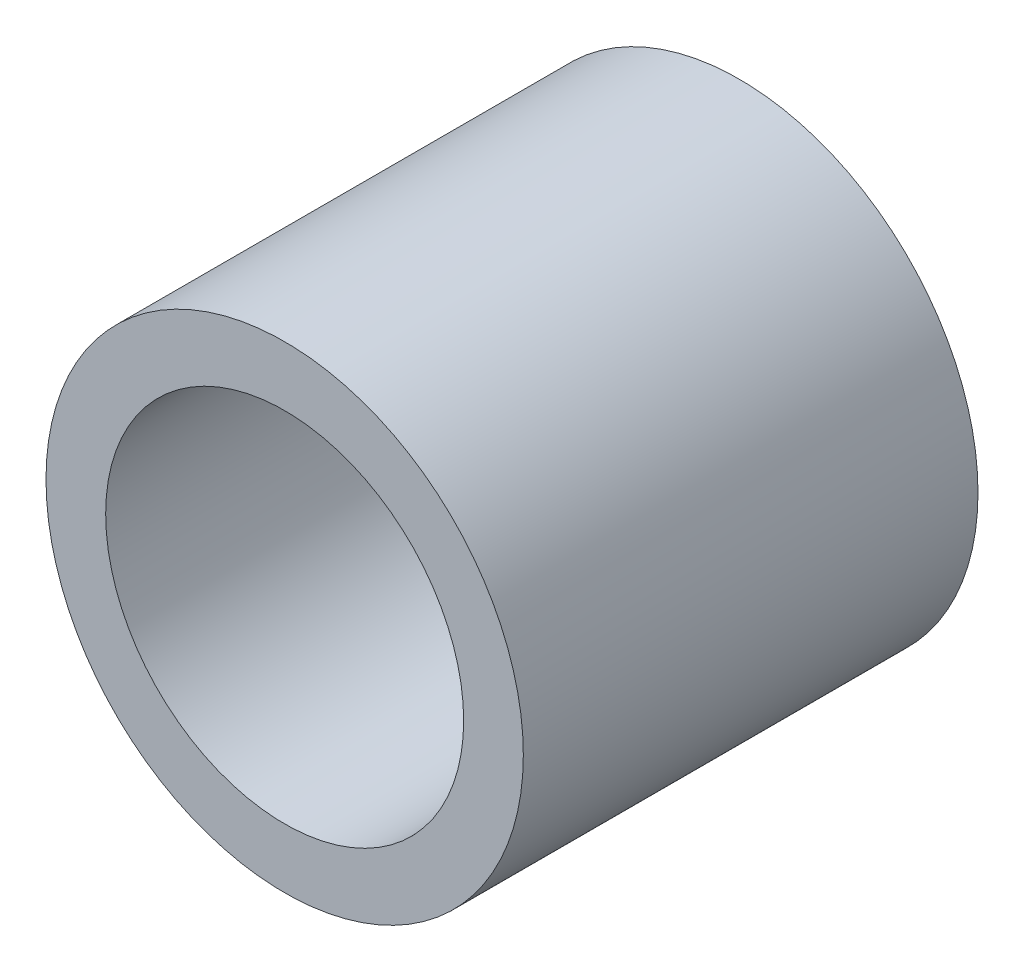
ISO-10303-21;
HEADER;
FILE_DESCRIPTION(('STEP AP214'),'2;1');
FILE_NAME('part.step','',(''),(''),'','','');
FILE_SCHEMA(('AUTOMOTIVE_DESIGN { 1 0 10303 214 1 1 1 1 }'));
ENDSEC;
DATA;
#1=APPLICATION_CONTEXT('core data for automotive mechanical design processes');
#2=APPLICATION_PROTOCOL_DEFINITION('international standard','automotive_design',2000,#1);
#3=PRODUCT_CONTEXT('',#1,'mechanical');
#4=PRODUCT('Part','Part','',(#3));
#5=PRODUCT_RELATED_PRODUCT_CATEGORY('part','',(#4));
#6=PRODUCT_DEFINITION_FORMATION('','',#4);
#7=PRODUCT_DEFINITION_CONTEXT('part definition',#1,'design');
#8=PRODUCT_DEFINITION('design','',#6,#7);
#9=PRODUCT_DEFINITION_SHAPE('','',#8);
#10=(LENGTH_UNIT() NAMED_UNIT(*) SI_UNIT(.MILLI.,.METRE.));
#11=(NAMED_UNIT(*) PLANE_ANGLE_UNIT() SI_UNIT($,.RADIAN.));
#12=(NAMED_UNIT(*) SI_UNIT($,.STERADIAN.) SOLID_ANGLE_UNIT());
#13=UNCERTAINTY_MEASURE_WITH_UNIT(LENGTH_MEASURE(1.E-05),#10,'distance_accuracy_value','');
#14=(GEOMETRIC_REPRESENTATION_CONTEXT(3) GLOBAL_UNCERTAINTY_ASSIGNED_CONTEXT((#13)) GLOBAL_UNIT_ASSIGNED_CONTEXT((#10,
#11,#12)) REPRESENTATION_CONTEXT('',''));
#15=CARTESIAN_POINT('',(0.,0.,0.));
#16=DIRECTION('',(0.,0.,1.));
#17=DIRECTION('',(1.,0.,0.));
#18=AXIS2_PLACEMENT_3D('',#15,#16,#17);
#19=CARTESIAN_POINT('',(0.,0.,3.81));
#20=DIRECTION('',(0.,0.,1.));
#21=DIRECTION('',(1.,0.,0.));
#22=AXIS2_PLACEMENT_3D('',#19,#20,#21);
#23=PLANE('',#22);
#24=CARTESIAN_POINT('',(0.,0.,3.81));
#25=DIRECTION('',(0.,0.,1.));
#26=DIRECTION('',(1.,0.,0.));
#27=AXIS2_PLACEMENT_3D('',#24,#25,#26);
#28=CIRCLE('',#27,2.);
#29=CARTESIAN_POINT('',(-2.,0.,3.81));
#30=VERTEX_POINT('',#29);
#31=EDGE_CURVE('E10',#30,#30,#28,.T.);
#32=ORIENTED_EDGE('',*,*,#31,.T.);
#33=EDGE_LOOP('',(#32));
#34=FACE_BOUND('',#33,.T.);
#35=CARTESIAN_POINT('',(0.,0.,3.81));
#36=DIRECTION('',(0.,0.,1.));
#37=DIRECTION('',(1.,0.,0.));
#38=AXIS2_PLACEMENT_3D('',#35,#36,#37);
#39=CIRCLE('',#38,1.5);
#40=CARTESIAN_POINT('',(-1.5,0.,3.81));
#41=VERTEX_POINT('',#40);
#42=EDGE_CURVE('E42',#41,#41,#39,.T.);
#43=ORIENTED_EDGE('',*,*,#42,.F.);
#44=EDGE_LOOP('',(#43));
#45=FACE_BOUND('',#44,.T.);
#46=ADVANCED_FACE('F31',(#34,#45),#23,.T.);
#47=CARTESIAN_POINT('',(0.,0.,0.));
#48=DIRECTION('',(0.,0.,1.));
#49=DIRECTION('',(1.,0.,0.));
#50=AXIS2_PLACEMENT_3D('',#47,#48,#49);
#51=PLANE('',#50);
#52=CARTESIAN_POINT('',(0.,0.,0.));
#53=DIRECTION('',(0.,0.,1.));
#54=DIRECTION('',(1.,0.,0.));
#55=AXIS2_PLACEMENT_3D('',#52,#53,#54);
#56=CIRCLE('',#55,2.);
#57=CARTESIAN_POINT('',(-2.,0.,0.));
#58=VERTEX_POINT('',#57);
#59=EDGE_CURVE('E35',#58,#58,#56,.T.);
#60=ORIENTED_EDGE('',*,*,#59,.F.);
#61=EDGE_LOOP('',(#60));
#62=FACE_BOUND('',#61,.T.);
#63=CARTESIAN_POINT('',(0.,0.,0.));
#64=DIRECTION('',(0.,0.,1.));
#65=DIRECTION('',(1.,0.,0.));
#66=AXIS2_PLACEMENT_3D('',#63,#64,#65);
#67=CIRCLE('',#66,1.5);
#68=CARTESIAN_POINT('',(-1.5,0.,0.));
#69=VERTEX_POINT('',#68);
#70=EDGE_CURVE('E44',#69,#69,#67,.T.);
#71=ORIENTED_EDGE('',*,*,#70,.T.);
#72=EDGE_LOOP('',(#71));
#73=FACE_BOUND('',#72,.T.);
#74=ADVANCED_FACE('F54',(#62,#73),#51,.F.);
#75=CARTESIAN_POINT('',(0.,0.,3.81));
#76=DIRECTION('',(0.,0.,-1.));
#77=DIRECTION('',(-1.,0.,0.));
#78=AXIS2_PLACEMENT_3D('',#75,#76,#77);
#79=CYLINDRICAL_SURFACE('',#78,2.);
#80=CARTESIAN_POINT('',(-2.,0.,3.81));
#81=CARTESIAN_POINT('',(-2.,0.,3.7703125));
#82=CARTESIAN_POINT('',(-2.,0.,3.730625));
#83=CARTESIAN_POINT('',(-2.,0.,3.65125));
#84=CARTESIAN_POINT('',(-2.,0.,3.6115625));
#85=CARTESIAN_POINT('',(-2.,0.,3.5321875));
#86=CARTESIAN_POINT('',(-2.,0.,3.4925));
#87=CARTESIAN_POINT('',(-2.,0.,3.413125));
#88=CARTESIAN_POINT('',(-2.,0.,3.3734375));
#89=CARTESIAN_POINT('',(-2.,0.,3.2940625));
#90=CARTESIAN_POINT('',(-2.,0.,3.254375));
#91=CARTESIAN_POINT('',(-2.,0.,3.175));
#92=CARTESIAN_POINT('',(-2.,0.,3.1353125));
#93=CARTESIAN_POINT('',(-2.,0.,3.0559375));
#94=CARTESIAN_POINT('',(-2.,0.,3.01625));
#95=CARTESIAN_POINT('',(-2.,0.,2.936875));
#96=CARTESIAN_POINT('',(-2.,0.,2.8971875));
#97=CARTESIAN_POINT('',(-2.,0.,2.8178125));
#98=CARTESIAN_POINT('',(-2.,0.,2.778125));
#99=CARTESIAN_POINT('',(-2.,0.,2.69875));
#100=CARTESIAN_POINT('',(-2.,0.,2.6590625));
#101=CARTESIAN_POINT('',(-2.,0.,2.5796875));
#102=CARTESIAN_POINT('',(-2.,0.,2.54));
#103=CARTESIAN_POINT('',(-2.,0.,2.460625));
#104=CARTESIAN_POINT('',(-2.,0.,2.4209375));
#105=CARTESIAN_POINT('',(-2.,0.,2.3415625));
#106=CARTESIAN_POINT('',(-2.,0.,2.301875));
#107=CARTESIAN_POINT('',(-2.,0.,2.2225));
#108=CARTESIAN_POINT('',(-2.,0.,2.1828125));
#109=CARTESIAN_POINT('',(-2.,0.,2.1034375));
#110=CARTESIAN_POINT('',(-2.,0.,2.06375));
#111=CARTESIAN_POINT('',(-2.,0.,1.984375));
#112=CARTESIAN_POINT('',(-2.,0.,1.9446875));
#113=CARTESIAN_POINT('',(-2.,0.,1.8653125));
#114=CARTESIAN_POINT('',(-2.,0.,1.825625));
#115=CARTESIAN_POINT('',(-2.,0.,1.74625));
#116=CARTESIAN_POINT('',(-2.,0.,1.7065625));
#117=CARTESIAN_POINT('',(-2.,0.,1.6271875));
#118=CARTESIAN_POINT('',(-2.,0.,1.5875));
#119=CARTESIAN_POINT('',(-2.,0.,1.508125));
#120=CARTESIAN_POINT('',(-2.,0.,1.4684375));
#121=CARTESIAN_POINT('',(-2.,0.,1.3890625));
#122=CARTESIAN_POINT('',(-2.,0.,1.349375));
#123=CARTESIAN_POINT('',(-2.,0.,1.27));
#124=CARTESIAN_POINT('',(-2.,0.,1.2303125));
#125=CARTESIAN_POINT('',(-2.,0.,1.1509375));
#126=CARTESIAN_POINT('',(-2.,0.,1.11125));
#127=CARTESIAN_POINT('',(-2.,0.,1.031875));
#128=CARTESIAN_POINT('',(-2.,0.,0.9921875));
#129=CARTESIAN_POINT('',(-2.,0.,0.9128125));
#130=CARTESIAN_POINT('',(-2.,0.,0.873125));
#131=CARTESIAN_POINT('',(-2.,0.,0.79375));
#132=CARTESIAN_POINT('',(-2.,0.,0.7540625));
#133=CARTESIAN_POINT('',(-2.,0.,0.6746875));
#134=CARTESIAN_POINT('',(-2.,0.,0.635));
#135=CARTESIAN_POINT('',(-2.,0.,0.555625));
#136=CARTESIAN_POINT('',(-2.,0.,0.5159375));
#137=CARTESIAN_POINT('',(-2.,0.,0.4365625));
#138=CARTESIAN_POINT('',(-2.,0.,0.396875));
#139=CARTESIAN_POINT('',(-2.,0.,0.3175));
#140=CARTESIAN_POINT('',(-2.,0.,0.2778125));
#141=CARTESIAN_POINT('',(-2.,0.,0.1984375));
#142=CARTESIAN_POINT('',(-2.,0.,0.15875));
#143=CARTESIAN_POINT('',(-2.,0.,0.0793749999999999));
#144=CARTESIAN_POINT('',(-2.,0.,0.0396874999999999));
#145=CARTESIAN_POINT('',(-2.,0.,0.));
#146=B_SPLINE_CURVE_WITH_KNOTS('',3,(#80,#81,#82,#83,#84,#85,#86,#87,#88,#89,#90,#91,#92,#93,
#94,#95,#96,#97,#98,#99,#100,#101,#102,#103,#104,#105,#106,#107,#108,#109,#110,#111,#112,#113,
#114,#115,#116,#117,#118,#119,#120,#121,#122,#123,#124,#125,#126,#127,#128,#129,#130,#131,#132,
#133,#134,#135,#136,#137,#138,#139,#140,#141,#142,#143,#144,#145),.UNSPECIFIED.,.F.,.F.,(4,2,2,
2,2,2,2,2,2,2,2,2,2,2,2,2,2,2,2,2,2,2,2,2,2,2,2,2,2,2,2,2,4),(0.,0.1190625,0.238125,0.3571875,
0.47625,0.595312499999999,0.714375,0.833437499999999,0.952499999999999,1.0715625,1.190625,
1.3096875,1.42875,1.5478125,1.666875,1.7859375,1.905,2.0240625,2.143125,2.2621875,2.38125,
2.5003125,2.619375,2.7384375,2.8575,2.9765625,3.095625,3.2146875,3.33375,3.4528125,3.571875,
3.6909375,3.81),.UNSPECIFIED.);
#147=EDGE_CURVE('BSEAM33',#30,#58,#146,.T.);
#148=ORIENTED_EDGE('',*,*,#31,.F.);
#149=ORIENTED_EDGE('',*,*,#59,.T.);
#150=ORIENTED_EDGE('',*,*,#147,.T.);
#151=ORIENTED_EDGE('',*,*,#147,.F.);
#152=EDGE_LOOP('',(#148,#150,#149,#151));
#153=FACE_BOUND('',#152,.T.);
#154=ADVANCED_FACE('F33',(#153),#79,.T.);
#155=CARTESIAN_POINT('',(0.,0.,3.81));
#156=DIRECTION('',(0.,0.,-1.));
#157=DIRECTION('',(-1.,0.,0.));
#158=AXIS2_PLACEMENT_3D('',#155,#156,#157);
#159=CYLINDRICAL_SURFACE('',#158,1.5);
#160=CARTESIAN_POINT('',(-1.5,0.,3.81));
#161=CARTESIAN_POINT('',(-1.5,0.,3.7703125));
#162=CARTESIAN_POINT('',(-1.5,0.,3.730625));
#163=CARTESIAN_POINT('',(-1.5,0.,3.65125));
#164=CARTESIAN_POINT('',(-1.5,0.,3.6115625));
#165=CARTESIAN_POINT('',(-1.5,0.,3.5321875));
#166=CARTESIAN_POINT('',(-1.5,0.,3.4925));
#167=CARTESIAN_POINT('',(-1.5,0.,3.413125));
#168=CARTESIAN_POINT('',(-1.5,0.,3.3734375));
#169=CARTESIAN_POINT('',(-1.5,0.,3.2940625));
#170=CARTESIAN_POINT('',(-1.5,0.,3.254375));
#171=CARTESIAN_POINT('',(-1.5,0.,3.175));
#172=CARTESIAN_POINT('',(-1.5,0.,3.1353125));
#173=CARTESIAN_POINT('',(-1.5,0.,3.0559375));
#174=CARTESIAN_POINT('',(-1.5,0.,3.01625));
#175=CARTESIAN_POINT('',(-1.5,0.,2.936875));
#176=CARTESIAN_POINT('',(-1.5,0.,2.8971875));
#177=CARTESIAN_POINT('',(-1.5,0.,2.8178125));
#178=CARTESIAN_POINT('',(-1.5,0.,2.778125));
#179=CARTESIAN_POINT('',(-1.5,0.,2.69875));
#180=CARTESIAN_POINT('',(-1.5,0.,2.6590625));
#181=CARTESIAN_POINT('',(-1.5,0.,2.5796875));
#182=CARTESIAN_POINT('',(-1.5,0.,2.54));
#183=CARTESIAN_POINT('',(-1.5,0.,2.460625));
#184=CARTESIAN_POINT('',(-1.5,0.,2.4209375));
#185=CARTESIAN_POINT('',(-1.5,0.,2.3415625));
#186=CARTESIAN_POINT('',(-1.5,0.,2.301875));
#187=CARTESIAN_POINT('',(-1.5,0.,2.2225));
#188=CARTESIAN_POINT('',(-1.5,0.,2.1828125));
#189=CARTESIAN_POINT('',(-1.5,0.,2.1034375));
#190=CARTESIAN_POINT('',(-1.5,0.,2.06375));
#191=CARTESIAN_POINT('',(-1.5,0.,1.984375));
#192=CARTESIAN_POINT('',(-1.5,0.,1.9446875));
#193=CARTESIAN_POINT('',(-1.5,0.,1.8653125));
#194=CARTESIAN_POINT('',(-1.5,0.,1.825625));
#195=CARTESIAN_POINT('',(-1.5,0.,1.74625));
#196=CARTESIAN_POINT('',(-1.5,0.,1.7065625));
#197=CARTESIAN_POINT('',(-1.5,0.,1.6271875));
#198=CARTESIAN_POINT('',(-1.5,0.,1.5875));
#199=CARTESIAN_POINT('',(-1.5,0.,1.508125));
#200=CARTESIAN_POINT('',(-1.5,0.,1.4684375));
#201=CARTESIAN_POINT('',(-1.5,0.,1.3890625));
#202=CARTESIAN_POINT('',(-1.5,0.,1.349375));
#203=CARTESIAN_POINT('',(-1.5,0.,1.27));
#204=CARTESIAN_POINT('',(-1.5,0.,1.2303125));
#205=CARTESIAN_POINT('',(-1.5,0.,1.1509375));
#206=CARTESIAN_POINT('',(-1.5,0.,1.11125));
#207=CARTESIAN_POINT('',(-1.5,0.,1.031875));
#208=CARTESIAN_POINT('',(-1.5,0.,0.9921875));
#209=CARTESIAN_POINT('',(-1.5,0.,0.9128125));
#210=CARTESIAN_POINT('',(-1.5,0.,0.873125));
#211=CARTESIAN_POINT('',(-1.5,0.,0.79375));
#212=CARTESIAN_POINT('',(-1.5,0.,0.7540625));
#213=CARTESIAN_POINT('',(-1.5,0.,0.6746875));
#214=CARTESIAN_POINT('',(-1.5,0.,0.635));
#215=CARTESIAN_POINT('',(-1.5,0.,0.555625));
#216=CARTESIAN_POINT('',(-1.5,0.,0.5159375));
#217=CARTESIAN_POINT('',(-1.5,0.,0.4365625));
#218=CARTESIAN_POINT('',(-1.5,0.,0.396875));
#219=CARTESIAN_POINT('',(-1.5,0.,0.3175));
#220=CARTESIAN_POINT('',(-1.5,0.,0.2778125));
#221=CARTESIAN_POINT('',(-1.5,0.,0.1984375));
#222=CARTESIAN_POINT('',(-1.5,0.,0.15875));
#223=CARTESIAN_POINT('',(-1.5,0.,0.0793749999999999));
#224=CARTESIAN_POINT('',(-1.5,0.,0.0396874999999999));
#225=CARTESIAN_POINT('',(-1.5,0.,0.));
#226=B_SPLINE_CURVE_WITH_KNOTS('',3,(#160,#161,#162,#163,#164,#165,#166,#167,#168,#169,#170,
#171,#172,#173,#174,#175,#176,#177,#178,#179,#180,#181,#182,#183,#184,#185,#186,#187,#188,#189,
#190,#191,#192,#193,#194,#195,#196,#197,#198,#199,#200,#201,#202,#203,#204,#205,#206,#207,#208,
#209,#210,#211,#212,#213,#214,#215,#216,#217,#218,#219,#220,#221,#222,#223,#224,#225),
.UNSPECIFIED.,.F.,.F.,(4,2,2,2,2,2,2,2,2,2,2,2,2,2,2,2,2,2,2,2,2,2,2,2,2,2,2,2,2,2,2,2,4),(0.,
0.1190625,0.238125,0.3571875,0.47625,0.595312499999999,0.714375,0.833437499999999,
0.952499999999999,1.0715625,1.190625,1.3096875,1.42875,1.5478125,1.666875,1.7859375,1.905,
2.0240625,2.143125,2.2621875,2.38125,2.5003125,2.619375,2.7384375,2.8575,2.9765625,3.095625,
3.2146875,3.33375,3.4528125,3.571875,3.6909375,3.81),.UNSPECIFIED.);
#227=EDGE_CURVE('BSEAM50',#41,#69,#226,.T.);
#228=ORIENTED_EDGE('',*,*,#42,.T.);
#229=ORIENTED_EDGE('',*,*,#70,.F.);
#230=ORIENTED_EDGE('',*,*,#227,.T.);
#231=ORIENTED_EDGE('',*,*,#227,.F.);
#232=EDGE_LOOP('',(#228,#230,#229,#231));
#233=FACE_BOUND('',#232,.T.);
#234=ADVANCED_FACE('F50',(#233),#159,.F.);
#235=CLOSED_SHELL('',(#46,#74,#154,#234));
#236=MANIFOLD_SOLID_BREP('B2',#235);
#237=ADVANCED_BREP_SHAPE_REPRESENTATION('',(#18,#236),#14);
#238=SHAPE_DEFINITION_REPRESENTATION(#9,#237);
ENDSEC;
END-ISO-10303-21;
